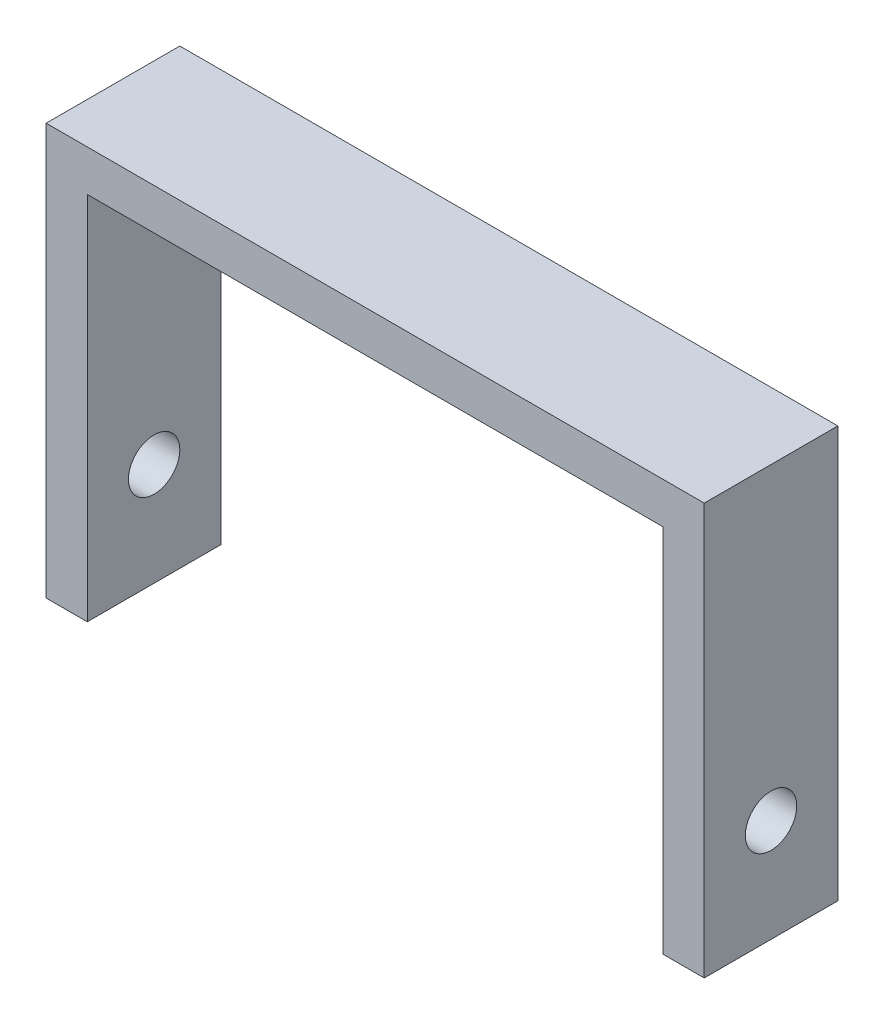
ISO-10303-21;
HEADER;
FILE_DESCRIPTION(('STEP AP214'),'2;1');
FILE_NAME('part.step','',(''),(''),'','','');
FILE_SCHEMA(('AUTOMOTIVE_DESIGN { 1 0 10303 214 1 1 1 1 }'));
ENDSEC;
DATA;
#1=APPLICATION_CONTEXT('core data for automotive mechanical design processes');
#2=APPLICATION_PROTOCOL_DEFINITION('international standard','automotive_design',2000,#1);
#3=PRODUCT_CONTEXT('',#1,'mechanical');
#4=PRODUCT('Part','Part','',(#3));
#5=PRODUCT_RELATED_PRODUCT_CATEGORY('part','',(#4));
#6=PRODUCT_DEFINITION_FORMATION('','',#4);
#7=PRODUCT_DEFINITION_CONTEXT('part definition',#1,'design');
#8=PRODUCT_DEFINITION('design','',#6,#7);
#9=PRODUCT_DEFINITION_SHAPE('','',#8);
#10=(LENGTH_UNIT() NAMED_UNIT(*) SI_UNIT(.MILLI.,.METRE.));
#11=(NAMED_UNIT(*) PLANE_ANGLE_UNIT() SI_UNIT($,.RADIAN.));
#12=(NAMED_UNIT(*) SI_UNIT($,.STERADIAN.) SOLID_ANGLE_UNIT());
#13=UNCERTAINTY_MEASURE_WITH_UNIT(LENGTH_MEASURE(1.E-05),#10,'distance_accuracy_value','');
#14=(GEOMETRIC_REPRESENTATION_CONTEXT(3) GLOBAL_UNCERTAINTY_ASSIGNED_CONTEXT((#13)) GLOBAL_UNIT_ASSIGNED_CONTEXT((#10,
#11,#12)) REPRESENTATION_CONTEXT('',''));
#15=CARTESIAN_POINT('',(0.,0.,0.));
#16=DIRECTION('',(0.,0.,1.));
#17=DIRECTION('',(1.,0.,0.));
#18=AXIS2_PLACEMENT_3D('',#15,#16,#17);
#19=CARTESIAN_POINT('',(4.,0.,13.));
#20=DIRECTION('',(0.,1.,0.));
#21=DIRECTION('',(0.,0.,1.));
#22=AXIS2_PLACEMENT_3D('',#19,#20,#21);
#23=PLANE('',#22);
#24=DIRECTION('',(1.,0.,0.));
#25=VECTOR('',#24,1.);
#26=CARTESIAN_POINT('',(4.,0.,0.));
#27=LINE('',#26,#25);
#28=CARTESIAN_POINT('',(0.,0.,0.));
#29=VERTEX_POINT('',#28);
#30=CARTESIAN_POINT('',(4.,0.,0.));
#31=VERTEX_POINT('',#30);
#32=EDGE_CURVE('E133',#29,#31,#27,.T.);
#33=ORIENTED_EDGE('',*,*,#32,.T.);
#34=DIRECTION('',(0.,0.,-1.));
#35=VECTOR('',#34,1.);
#36=CARTESIAN_POINT('',(4.,0.,13.));
#37=LINE('',#36,#35);
#38=CARTESIAN_POINT('',(4.,0.,13.));
#39=VERTEX_POINT('',#38);
#40=EDGE_CURVE('E11',#39,#31,#37,.T.);
#41=ORIENTED_EDGE('',*,*,#40,.F.);
#42=DIRECTION('',(1.,0.,0.));
#43=VECTOR('',#42,1.);
#44=CARTESIAN_POINT('',(4.,0.,13.));
#45=LINE('',#44,#43);
#46=CARTESIAN_POINT('',(0.,0.,13.));
#47=VERTEX_POINT('',#46);
#48=EDGE_CURVE('E148',#47,#39,#45,.T.);
#49=ORIENTED_EDGE('',*,*,#48,.F.);
#50=DIRECTION('',(0.,0.,-1.));
#51=VECTOR('',#50,1.);
#52=CARTESIAN_POINT('',(0.,0.,13.));
#53=LINE('',#52,#51);
#54=EDGE_CURVE('E129',#47,#29,#53,.T.);
#55=ORIENTED_EDGE('',*,*,#54,.T.);
#56=EDGE_LOOP('',(#33,#41,#49,#55));
#57=FACE_BOUND('',#56,.T.);
#58=ADVANCED_FACE('F37',(#57),#23,.F.);
#59=CARTESIAN_POINT('',(4.,36.,13.));
#60=DIRECTION('',(-1.,0.,0.));
#61=DIRECTION('',(0.,-1.,0.));
#62=AXIS2_PLACEMENT_3D('',#59,#60,#61);
#63=PLANE('',#62);
#64=CARTESIAN_POINT('',(4.,10.,6.5));
#65=DIRECTION('',(-1.,0.,0.));
#66=DIRECTION('',(0.,-1.,0.));
#67=AXIS2_PLACEMENT_3D('',#64,#65,#66);
#68=CIRCLE('',#67,2.5);
#69=CARTESIAN_POINT('',(4.,7.5,6.5));
#70=VERTEX_POINT('',#69);
#71=EDGE_CURVE('E137',#70,#70,#68,.T.);
#72=ORIENTED_EDGE('',*,*,#71,.T.);
#73=EDGE_LOOP('',(#72));
#74=FACE_BOUND('',#73,.T.);
#75=DIRECTION('',(0.,1.,0.));
#76=VECTOR('',#75,1.);
#77=CARTESIAN_POINT('',(4.,36.,0.));
#78=LINE('',#77,#76);
#79=CARTESIAN_POINT('',(4.,36.,0.));
#80=VERTEX_POINT('',#79);
#81=EDGE_CURVE('E136',#31,#80,#78,.T.);
#82=ORIENTED_EDGE('',*,*,#81,.T.);
#83=DIRECTION('',(0.,0.,-1.));
#84=VECTOR('',#83,1.);
#85=CARTESIAN_POINT('',(4.,36.,13.));
#86=LINE('',#85,#84);
#87=CARTESIAN_POINT('',(4.,36.,13.));
#88=VERTEX_POINT('',#87);
#89=EDGE_CURVE('E45',#88,#80,#86,.T.);
#90=ORIENTED_EDGE('',*,*,#89,.F.);
#91=DIRECTION('',(0.,1.,0.));
#92=VECTOR('',#91,1.);
#93=CARTESIAN_POINT('',(4.,36.,13.));
#94=LINE('',#93,#92);
#95=EDGE_CURVE('E96',#39,#88,#94,.T.);
#96=ORIENTED_EDGE('',*,*,#95,.F.);
#97=ORIENTED_EDGE('',*,*,#40,.T.);
#98=EDGE_LOOP('',(#82,#90,#96,#97));
#99=FACE_BOUND('',#98,.T.);
#100=ADVANCED_FACE('F202',(#74,#99),#63,.F.);
#101=CARTESIAN_POINT('',(60.,36.,13.));
#102=DIRECTION('',(0.,1.,0.));
#103=DIRECTION('',(-1.,0.,0.));
#104=AXIS2_PLACEMENT_3D('',#101,#102,#103);
#105=PLANE('',#104);
#106=DIRECTION('',(1.,0.,0.));
#107=VECTOR('',#106,1.);
#108=CARTESIAN_POINT('',(60.,36.,0.));
#109=LINE('',#108,#107);
#110=CARTESIAN_POINT('',(60.,36.,0.));
#111=VERTEX_POINT('',#110);
#112=EDGE_CURVE('E139',#80,#111,#109,.T.);
#113=ORIENTED_EDGE('',*,*,#112,.T.);
#114=DIRECTION('',(0.,0.,-1.));
#115=VECTOR('',#114,1.);
#116=CARTESIAN_POINT('',(60.,36.,13.));
#117=LINE('',#116,#115);
#118=CARTESIAN_POINT('',(60.,36.,13.));
#119=VERTEX_POINT('',#118);
#120=EDGE_CURVE('E155',#119,#111,#117,.T.);
#121=ORIENTED_EDGE('',*,*,#120,.F.);
#122=DIRECTION('',(1.,0.,0.));
#123=VECTOR('',#122,1.);
#124=CARTESIAN_POINT('',(60.,36.,13.));
#125=LINE('',#124,#123);
#126=EDGE_CURVE('E163',#88,#119,#125,.T.);
#127=ORIENTED_EDGE('',*,*,#126,.F.);
#128=ORIENTED_EDGE('',*,*,#89,.T.);
#129=EDGE_LOOP('',(#113,#121,#127,#128));
#130=FACE_BOUND('',#129,.T.);
#131=ADVANCED_FACE('F161',(#130),#105,.F.);
#132=CARTESIAN_POINT('',(60.,0.,13.));
#133=DIRECTION('',(1.,0.,0.));
#134=DIRECTION('',(0.,0.,-1.));
#135=AXIS2_PLACEMENT_3D('',#132,#133,#134);
#136=PLANE('',#135);
#137=CARTESIAN_POINT('',(60.,10.,6.5));
#138=DIRECTION('',(1.,0.,0.));
#139=DIRECTION('',(0.,0.,-1.));
#140=AXIS2_PLACEMENT_3D('',#137,#138,#139);
#141=CIRCLE('',#140,2.5);
#142=CARTESIAN_POINT('',(60.,10.,4.));
#143=VERTEX_POINT('',#142);
#144=EDGE_CURVE('E183',#143,#143,#141,.T.);
#145=ORIENTED_EDGE('',*,*,#144,.T.);
#146=EDGE_LOOP('',(#145));
#147=FACE_BOUND('',#146,.T.);
#148=DIRECTION('',(0.,-1.,0.));
#149=VECTOR('',#148,1.);
#150=CARTESIAN_POINT('',(60.,0.,0.));
#151=LINE('',#150,#149);
#152=CARTESIAN_POINT('',(60.,0.,0.));
#153=VERTEX_POINT('',#152);
#154=EDGE_CURVE('E141',#111,#153,#151,.T.);
#155=ORIENTED_EDGE('',*,*,#154,.T.);
#156=DIRECTION('',(0.,0.,-1.));
#157=VECTOR('',#156,1.);
#158=CARTESIAN_POINT('',(60.,0.,13.));
#159=LINE('',#158,#157);
#160=CARTESIAN_POINT('',(60.,0.,13.));
#161=VERTEX_POINT('',#160);
#162=EDGE_CURVE('E152',#161,#153,#159,.T.);
#163=ORIENTED_EDGE('',*,*,#162,.F.);
#164=DIRECTION('',(0.,-1.,0.));
#165=VECTOR('',#164,1.);
#166=CARTESIAN_POINT('',(60.,0.,13.));
#167=LINE('',#166,#165);
#168=EDGE_CURVE('E175',#119,#161,#167,.T.);
#169=ORIENTED_EDGE('',*,*,#168,.F.);
#170=ORIENTED_EDGE('',*,*,#120,.T.);
#171=EDGE_LOOP('',(#155,#163,#169,#170));
#172=FACE_BOUND('',#171,.T.);
#173=ADVANCED_FACE('F171',(#147,#172),#136,.F.);
#174=CARTESIAN_POINT('',(64.,0.,13.));
#175=DIRECTION('',(0.,1.,0.));
#176=DIRECTION('',(0.,0.,1.));
#177=AXIS2_PLACEMENT_3D('',#174,#175,#176);
#178=PLANE('',#177);
#179=DIRECTION('',(1.,0.,0.));
#180=VECTOR('',#179,1.);
#181=CARTESIAN_POINT('',(64.,0.,0.));
#182=LINE('',#181,#180);
#183=CARTESIAN_POINT('',(64.,0.,0.));
#184=VERTEX_POINT('',#183);
#185=EDGE_CURVE('E143',#153,#184,#182,.T.);
#186=ORIENTED_EDGE('',*,*,#185,.T.);
#187=DIRECTION('',(0.,0.,-1.));
#188=VECTOR('',#187,1.);
#189=CARTESIAN_POINT('',(64.,0.,13.));
#190=LINE('',#189,#188);
#191=CARTESIAN_POINT('',(64.,0.,13.));
#192=VERTEX_POINT('',#191);
#193=EDGE_CURVE('E124',#192,#184,#190,.T.);
#194=ORIENTED_EDGE('',*,*,#193,.F.);
#195=DIRECTION('',(1.,0.,0.));
#196=VECTOR('',#195,1.);
#197=CARTESIAN_POINT('',(64.,0.,13.));
#198=LINE('',#197,#196);
#199=EDGE_CURVE('E115',#161,#192,#198,.T.);
#200=ORIENTED_EDGE('',*,*,#199,.F.);
#201=ORIENTED_EDGE('',*,*,#162,.T.);
#202=EDGE_LOOP('',(#186,#194,#200,#201));
#203=FACE_BOUND('',#202,.T.);
#204=ADVANCED_FACE('F174',(#203),#178,.F.);
#205=CARTESIAN_POINT('',(64.,40.,13.));
#206=DIRECTION('',(-1.,0.,0.));
#207=DIRECTION('',(0.,0.,1.));
#208=AXIS2_PLACEMENT_3D('',#205,#206,#207);
#209=PLANE('',#208);
#210=CARTESIAN_POINT('',(64.,10.,6.5));
#211=DIRECTION('',(1.,0.,0.));
#212=DIRECTION('',(0.,0.,-1.));
#213=AXIS2_PLACEMENT_3D('',#210,#211,#212);
#214=CIRCLE('',#213,2.5);
#215=CARTESIAN_POINT('',(64.,10.,4.));
#216=VERTEX_POINT('',#215);
#217=EDGE_CURVE('E187',#216,#216,#214,.T.);
#218=ORIENTED_EDGE('',*,*,#217,.F.);
#219=EDGE_LOOP('',(#218));
#220=FACE_BOUND('',#219,.T.);
#221=DIRECTION('',(0.,1.,0.));
#222=VECTOR('',#221,1.);
#223=CARTESIAN_POINT('',(64.,40.,0.));
#224=LINE('',#223,#222);
#225=CARTESIAN_POINT('',(64.,40.,0.));
#226=VERTEX_POINT('',#225);
#227=EDGE_CURVE('E123',#184,#226,#224,.T.);
#228=ORIENTED_EDGE('',*,*,#227,.T.);
#229=DIRECTION('',(0.,0.,-1.));
#230=VECTOR('',#229,1.);
#231=CARTESIAN_POINT('',(64.,40.,13.));
#232=LINE('',#231,#230);
#233=CARTESIAN_POINT('',(64.,40.,13.));
#234=VERTEX_POINT('',#233);
#235=EDGE_CURVE('E120',#234,#226,#232,.T.);
#236=ORIENTED_EDGE('',*,*,#235,.F.);
#237=DIRECTION('',(0.,1.,0.));
#238=VECTOR('',#237,1.);
#239=CARTESIAN_POINT('',(64.,40.,13.));
#240=LINE('',#239,#238);
#241=EDGE_CURVE('E109',#192,#234,#240,.T.);
#242=ORIENTED_EDGE('',*,*,#241,.F.);
#243=ORIENTED_EDGE('',*,*,#193,.T.);
#244=EDGE_LOOP('',(#228,#236,#242,#243));
#245=FACE_BOUND('',#244,.T.);
#246=ADVANCED_FACE('F121',(#220,#245),#209,.F.);
#247=CARTESIAN_POINT('',(0.,40.,13.));
#248=DIRECTION('',(0.,-1.,0.));
#249=DIRECTION('',(0.,0.,-1.));
#250=AXIS2_PLACEMENT_3D('',#247,#248,#249);
#251=PLANE('',#250);
#252=DIRECTION('',(-1.,0.,0.));
#253=VECTOR('',#252,1.);
#254=CARTESIAN_POINT('',(0.,40.,0.));
#255=LINE('',#254,#253);
#256=CARTESIAN_POINT('',(0.,40.,0.));
#257=VERTEX_POINT('',#256);
#258=EDGE_CURVE('E82',#226,#257,#255,.T.);
#259=ORIENTED_EDGE('',*,*,#258,.T.);
#260=DIRECTION('',(0.,0.,-1.));
#261=VECTOR('',#260,1.);
#262=CARTESIAN_POINT('',(0.,40.,13.));
#263=LINE('',#262,#261);
#264=CARTESIAN_POINT('',(0.,40.,13.));
#265=VERTEX_POINT('',#264);
#266=EDGE_CURVE('E125',#265,#257,#263,.T.);
#267=ORIENTED_EDGE('',*,*,#266,.F.);
#268=DIRECTION('',(-1.,0.,0.));
#269=VECTOR('',#268,1.);
#270=CARTESIAN_POINT('',(0.,40.,13.));
#271=LINE('',#270,#269);
#272=EDGE_CURVE('E113',#234,#265,#271,.T.);
#273=ORIENTED_EDGE('',*,*,#272,.F.);
#274=ORIENTED_EDGE('',*,*,#235,.T.);
#275=EDGE_LOOP('',(#259,#267,#273,#274));
#276=FACE_BOUND('',#275,.T.);
#277=ADVANCED_FACE('F127',(#276),#251,.F.);
#278=CARTESIAN_POINT('',(0.,0.,13.));
#279=DIRECTION('',(1.,0.,0.));
#280=DIRECTION('',(0.,0.,-1.));
#281=AXIS2_PLACEMENT_3D('',#278,#279,#280);
#282=PLANE('',#281);
#283=CARTESIAN_POINT('',(0.,10.,6.5));
#284=DIRECTION('',(1.,0.,0.));
#285=DIRECTION('',(0.,0.,-1.));
#286=AXIS2_PLACEMENT_3D('',#283,#284,#285);
#287=CIRCLE('',#286,2.5);
#288=CARTESIAN_POINT('',(0.,10.,4.));
#289=VERTEX_POINT('',#288);
#290=EDGE_CURVE('E186',#289,#289,#287,.T.);
#291=ORIENTED_EDGE('',*,*,#290,.T.);
#292=EDGE_LOOP('',(#291));
#293=FACE_BOUND('',#292,.T.);
#294=DIRECTION('',(0.,-1.,0.));
#295=VECTOR('',#294,1.);
#296=CARTESIAN_POINT('',(0.,0.,0.));
#297=LINE('',#296,#295);
#298=EDGE_CURVE('E88',#257,#29,#297,.T.);
#299=ORIENTED_EDGE('',*,*,#298,.T.);
#300=ORIENTED_EDGE('',*,*,#54,.F.);
#301=DIRECTION('',(0.,-1.,0.));
#302=VECTOR('',#301,1.);
#303=CARTESIAN_POINT('',(0.,0.,13.));
#304=LINE('',#303,#302);
#305=EDGE_CURVE('E53',#265,#47,#304,.T.);
#306=ORIENTED_EDGE('',*,*,#305,.F.);
#307=ORIENTED_EDGE('',*,*,#266,.T.);
#308=EDGE_LOOP('',(#299,#300,#306,#307));
#309=FACE_BOUND('',#308,.T.);
#310=ADVANCED_FACE('F193',(#293,#309),#282,.F.);
#311=CARTESIAN_POINT('',(0.,0.,13.));
#312=DIRECTION('',(0.,0.,-1.));
#313=DIRECTION('',(-1.,0.,0.));
#314=AXIS2_PLACEMENT_3D('',#311,#312,#313);
#315=PLANE('',#314);
#316=ORIENTED_EDGE('',*,*,#48,.T.);
#317=ORIENTED_EDGE('',*,*,#95,.T.);
#318=ORIENTED_EDGE('',*,*,#126,.T.);
#319=ORIENTED_EDGE('',*,*,#168,.T.);
#320=ORIENTED_EDGE('',*,*,#199,.T.);
#321=ORIENTED_EDGE('',*,*,#241,.T.);
#322=ORIENTED_EDGE('',*,*,#272,.T.);
#323=ORIENTED_EDGE('',*,*,#305,.T.);
#324=EDGE_LOOP('',(#316,#317,#318,#319,#320,#321,#322,#323));
#325=FACE_BOUND('',#324,.T.);
#326=ADVANCED_FACE('F111',(#325),#315,.F.);
#327=CARTESIAN_POINT('',(0.,0.,0.));
#328=DIRECTION('',(0.,0.,-1.));
#329=DIRECTION('',(-1.,0.,0.));
#330=AXIS2_PLACEMENT_3D('',#327,#328,#329);
#331=PLANE('',#330);
#332=ORIENTED_EDGE('',*,*,#32,.F.);
#333=ORIENTED_EDGE('',*,*,#298,.F.);
#334=ORIENTED_EDGE('',*,*,#258,.F.);
#335=ORIENTED_EDGE('',*,*,#227,.F.);
#336=ORIENTED_EDGE('',*,*,#185,.F.);
#337=ORIENTED_EDGE('',*,*,#154,.F.);
#338=ORIENTED_EDGE('',*,*,#112,.F.);
#339=ORIENTED_EDGE('',*,*,#81,.F.);
#340=EDGE_LOOP('',(#332,#333,#334,#335,#336,#337,#338,#339));
#341=FACE_BOUND('',#340,.T.);
#342=ADVANCED_FACE('F167',(#341),#331,.T.);
#343=CARTESIAN_POINT('',(0.,10.,6.5));
#344=DIRECTION('',(1.,0.,0.));
#345=DIRECTION('',(0.,0.,-1.));
#346=AXIS2_PLACEMENT_3D('',#343,#344,#345);
#347=CYLINDRICAL_SURFACE('',#346,2.5);
#348=ORIENTED_EDGE('',*,*,#290,.F.);
#349=EDGE_LOOP('',(#348));
#350=FACE_BOUND('',#349,.T.);
#351=ORIENTED_EDGE('',*,*,#71,.F.);
#352=EDGE_LOOP('',(#351));
#353=FACE_BOUND('',#352,.T.);
#354=ADVANCED_FACE('F195',(#350,#353),#347,.F.);
#355=ORIENTED_EDGE('',*,*,#217,.T.);
#356=EDGE_LOOP('',(#355));
#357=FACE_BOUND('',#356,.T.);
#358=ORIENTED_EDGE('',*,*,#144,.F.);
#359=EDGE_LOOP('',(#358));
#360=FACE_BOUND('',#359,.T.);
#361=ADVANCED_FACE('F198',(#357,#360),#347,.F.);
#362=CLOSED_SHELL('',(#58,#100,#131,#173,#204,#246,#277,#310,#326,#342,#354,#361));
#363=MANIFOLD_SOLID_BREP('B2',#362);
#364=ADVANCED_BREP_SHAPE_REPRESENTATION('',(#18,#363),#14);
#365=SHAPE_DEFINITION_REPRESENTATION(#9,#364);
ENDSEC;
END-ISO-10303-21;
